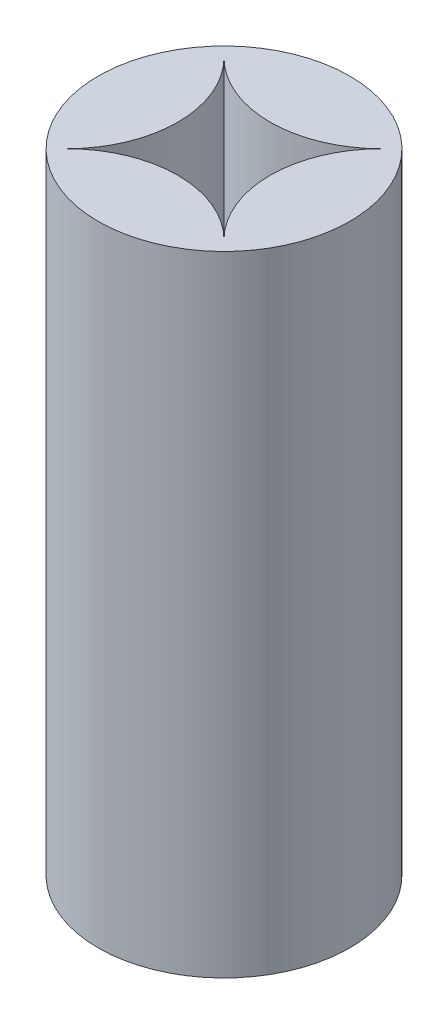
ISO-10303-21;
HEADER;
FILE_DESCRIPTION(('STEP AP214'),'2;1');
FILE_NAME('part.step','',(''),(''),'','','');
FILE_SCHEMA(('AUTOMOTIVE_DESIGN { 1 0 10303 214 1 1 1 1 }'));
ENDSEC;
DATA;
#1=APPLICATION_CONTEXT('core data for automotive mechanical design processes');
#2=APPLICATION_PROTOCOL_DEFINITION('international standard','automotive_design',2000,#1);
#3=PRODUCT_CONTEXT('',#1,'mechanical');
#4=PRODUCT('Part','Part','',(#3));
#5=PRODUCT_RELATED_PRODUCT_CATEGORY('part','',(#4));
#6=PRODUCT_DEFINITION_FORMATION('','',#4);
#7=PRODUCT_DEFINITION_CONTEXT('part definition',#1,'design');
#8=PRODUCT_DEFINITION('design','',#6,#7);
#9=PRODUCT_DEFINITION_SHAPE('','',#8);
#10=(LENGTH_UNIT() NAMED_UNIT(*) SI_UNIT(.MILLI.,.METRE.));
#11=(NAMED_UNIT(*) PLANE_ANGLE_UNIT() SI_UNIT($,.RADIAN.));
#12=(NAMED_UNIT(*) SI_UNIT($,.STERADIAN.) SOLID_ANGLE_UNIT());
#13=UNCERTAINTY_MEASURE_WITH_UNIT(LENGTH_MEASURE(1.E-05),#10,'distance_accuracy_value','');
#14=(GEOMETRIC_REPRESENTATION_CONTEXT(3) GLOBAL_UNCERTAINTY_ASSIGNED_CONTEXT((#13)) GLOBAL_UNIT_ASSIGNED_CONTEXT((#10,
#11,#12)) REPRESENTATION_CONTEXT('',''));
#15=CARTESIAN_POINT('',(0.,0.,0.));
#16=DIRECTION('',(0.,0.,1.));
#17=DIRECTION('',(1.,0.,0.));
#18=AXIS2_PLACEMENT_3D('',#15,#16,#17);
#19=CARTESIAN_POINT('',(0.,20.,0.));
#20=DIRECTION('',(0.,1.,0.));
#21=DIRECTION('',(0.,0.,1.));
#22=AXIS2_PLACEMENT_3D('',#19,#20,#21);
#23=PLANE('',#22);
#24=CARTESIAN_POINT('',(0.,20.,0.));
#25=DIRECTION('',(0.,1.,0.));
#26=DIRECTION('',(0.,0.,1.));
#27=AXIS2_PLACEMENT_3D('',#24,#25,#26);
#28=CIRCLE('',#27,4.);
#29=CARTESIAN_POINT('',(0.,20.,4.));
#30=VERTEX_POINT('',#29);
#31=EDGE_CURVE('E11',#30,#30,#28,.T.);
#32=ORIENTED_EDGE('',*,*,#31,.T.);
#33=EDGE_LOOP('',(#32));
#34=FACE_BOUND('',#33,.T.);
#35=CARTESIAN_POINT('',(0.,20.,-5.));
#36=DIRECTION('',(0.,-1.,0.));
#37=DIRECTION('',(0.,0.,1.));
#38=AXIS2_PLACEMENT_3D('',#35,#36,#37);
#39=CIRCLE('',#38,3.53553390593274);
#40=CARTESIAN_POINT('',(2.5,20.,-2.5));
#41=VERTEX_POINT('',#40);
#42=CARTESIAN_POINT('',(-2.5,20.,-2.5));
#43=VERTEX_POINT('',#42);
#44=EDGE_CURVE('E86',#41,#43,#39,.T.);
#45=ORIENTED_EDGE('',*,*,#44,.F.);
#46=CARTESIAN_POINT('',(5.,20.,0.));
#47=DIRECTION('',(0.,-1.,0.));
#48=DIRECTION('',(0.,0.,-1.));
#49=AXIS2_PLACEMENT_3D('',#46,#47,#48);
#50=CIRCLE('',#49,3.53553390593274);
#51=CARTESIAN_POINT('',(2.5,20.,2.5));
#52=VERTEX_POINT('',#51);
#53=EDGE_CURVE('E78',#52,#41,#50,.T.);
#54=ORIENTED_EDGE('',*,*,#53,.F.);
#55=CARTESIAN_POINT('',(0.,20.,5.));
#56=DIRECTION('',(0.,-1.,0.));
#57=DIRECTION('',(0.,0.,1.));
#58=AXIS2_PLACEMENT_3D('',#55,#56,#57);
#59=CIRCLE('',#58,3.53553390593274);
#60=CARTESIAN_POINT('',(-2.5,20.,2.5));
#61=VERTEX_POINT('',#60);
#62=EDGE_CURVE('E99',#61,#52,#59,.T.);
#63=ORIENTED_EDGE('',*,*,#62,.F.);
#64=CARTESIAN_POINT('',(-5.,20.,0.));
#65=DIRECTION('',(0.,-1.,0.));
#66=DIRECTION('',(0.,0.,-1.));
#67=AXIS2_PLACEMENT_3D('',#64,#65,#66);
#68=CIRCLE('',#67,3.53553390593274);
#69=EDGE_CURVE('E97',#43,#61,#68,.T.);
#70=ORIENTED_EDGE('',*,*,#69,.F.);
#71=EDGE_LOOP('',(#45,#54,#63,#70));
#72=FACE_BOUND('',#71,.T.);
#73=ADVANCED_FACE('F37',(#34,#72),#23,.T.);
#74=CARTESIAN_POINT('',(0.,0.,0.));
#75=DIRECTION('',(0.,1.,0.));
#76=DIRECTION('',(0.,0.,1.));
#77=AXIS2_PLACEMENT_3D('',#74,#75,#76);
#78=PLANE('',#77);
#79=CARTESIAN_POINT('',(0.,0.,0.));
#80=DIRECTION('',(0.,1.,0.));
#81=DIRECTION('',(0.,0.,1.));
#82=AXIS2_PLACEMENT_3D('',#79,#80,#81);
#83=CIRCLE('',#82,4.);
#84=CARTESIAN_POINT('',(0.,0.,4.));
#85=VERTEX_POINT('',#84);
#86=EDGE_CURVE('E41',#85,#85,#83,.T.);
#87=ORIENTED_EDGE('',*,*,#86,.F.);
#88=EDGE_LOOP('',(#87));
#89=FACE_BOUND('',#88,.T.);
#90=CARTESIAN_POINT('',(5.,0.,0.));
#91=DIRECTION('',(0.,-1.,0.));
#92=DIRECTION('',(0.,0.,-1.));
#93=AXIS2_PLACEMENT_3D('',#90,#91,#92);
#94=CIRCLE('',#93,3.53553390593274);
#95=CARTESIAN_POINT('',(2.5,0.,2.5));
#96=VERTEX_POINT('',#95);
#97=CARTESIAN_POINT('',(2.5,0.,-2.5));
#98=VERTEX_POINT('',#97);
#99=EDGE_CURVE('E60',#96,#98,#94,.T.);
#100=ORIENTED_EDGE('',*,*,#99,.T.);
#101=CARTESIAN_POINT('',(0.,0.,-5.));
#102=DIRECTION('',(0.,-1.,0.));
#103=DIRECTION('',(0.,0.,1.));
#104=AXIS2_PLACEMENT_3D('',#101,#102,#103);
#105=CIRCLE('',#104,3.53553390593274);
#106=CARTESIAN_POINT('',(-2.5,0.,-2.5));
#107=VERTEX_POINT('',#106);
#108=EDGE_CURVE('E93',#98,#107,#105,.T.);
#109=ORIENTED_EDGE('',*,*,#108,.T.);
#110=CARTESIAN_POINT('',(-5.,0.,0.));
#111=DIRECTION('',(0.,-1.,0.));
#112=DIRECTION('',(0.,0.,-1.));
#113=AXIS2_PLACEMENT_3D('',#110,#111,#112);
#114=CIRCLE('',#113,3.53553390593274);
#115=CARTESIAN_POINT('',(-2.5,0.,2.5));
#116=VERTEX_POINT('',#115);
#117=EDGE_CURVE('E105',#107,#116,#114,.T.);
#118=ORIENTED_EDGE('',*,*,#117,.T.);
#119=CARTESIAN_POINT('',(0.,0.,5.));
#120=DIRECTION('',(0.,-1.,0.));
#121=DIRECTION('',(0.,0.,1.));
#122=AXIS2_PLACEMENT_3D('',#119,#120,#121);
#123=CIRCLE('',#122,3.53553390593274);
#124=EDGE_CURVE('E87',#116,#96,#123,.T.);
#125=ORIENTED_EDGE('',*,*,#124,.T.);
#126=EDGE_LOOP('',(#100,#109,#118,#125));
#127=FACE_BOUND('',#126,.T.);
#128=ADVANCED_FACE('F116',(#89,#127),#78,.F.);
#129=CARTESIAN_POINT('',(0.,20.,0.));
#130=DIRECTION('',(0.,-1.,0.));
#131=DIRECTION('',(0.,0.,-1.));
#132=AXIS2_PLACEMENT_3D('',#129,#130,#131);
#133=CYLINDRICAL_SURFACE('',#132,4.);
#134=ORIENTED_EDGE('',*,*,#31,.F.);
#135=EDGE_LOOP('',(#134));
#136=FACE_BOUND('',#135,.T.);
#137=ORIENTED_EDGE('',*,*,#86,.T.);
#138=EDGE_LOOP('',(#137));
#139=FACE_BOUND('',#138,.T.);
#140=ADVANCED_FACE('F39',(#136,#139),#133,.T.);
#141=CARTESIAN_POINT('',(5.,20.,0.));
#142=DIRECTION('',(0.,-1.,0.));
#143=DIRECTION('',(0.,0.,-1.));
#144=AXIS2_PLACEMENT_3D('',#141,#142,#143);
#145=CYLINDRICAL_SURFACE('',#144,3.53553390593274);
#146=ORIENTED_EDGE('',*,*,#99,.F.);
#147=DIRECTION('',(0.,-1.,0.));
#148=VECTOR('',#147,1.);
#149=CARTESIAN_POINT('',(2.5,20.,2.5));
#150=LINE('',#149,#148);
#151=EDGE_CURVE('E82',#52,#96,#150,.T.);
#152=ORIENTED_EDGE('',*,*,#151,.F.);
#153=ORIENTED_EDGE('',*,*,#53,.T.);
#154=DIRECTION('',(0.,-1.,0.));
#155=VECTOR('',#154,1.);
#156=CARTESIAN_POINT('',(2.5,20.,-2.5));
#157=LINE('',#156,#155);
#158=EDGE_CURVE('E81',#41,#98,#157,.T.);
#159=ORIENTED_EDGE('',*,*,#158,.T.);
#160=EDGE_LOOP('',(#146,#152,#153,#159));
#161=FACE_BOUND('',#160,.T.);
#162=ADVANCED_FACE('F80',(#161),#145,.T.);
#163=CARTESIAN_POINT('',(0.,20.,-5.));
#164=DIRECTION('',(0.,-1.,0.));
#165=DIRECTION('',(0.,0.,-1.));
#166=AXIS2_PLACEMENT_3D('',#163,#164,#165);
#167=CYLINDRICAL_SURFACE('',#166,3.53553390593274);
#168=ORIENTED_EDGE('',*,*,#108,.F.);
#169=ORIENTED_EDGE('',*,*,#158,.F.);
#170=ORIENTED_EDGE('',*,*,#44,.T.);
#171=DIRECTION('',(0.,-1.,0.));
#172=VECTOR('',#171,1.);
#173=CARTESIAN_POINT('',(-2.5,20.,-2.5));
#174=LINE('',#173,#172);
#175=EDGE_CURVE('E94',#43,#107,#174,.T.);
#176=ORIENTED_EDGE('',*,*,#175,.T.);
#177=EDGE_LOOP('',(#168,#169,#170,#176));
#178=FACE_BOUND('',#177,.T.);
#179=ADVANCED_FACE('F90',(#178),#167,.T.);
#180=CARTESIAN_POINT('',(-5.,20.,0.));
#181=DIRECTION('',(0.,-1.,0.));
#182=DIRECTION('',(0.,0.,-1.));
#183=AXIS2_PLACEMENT_3D('',#180,#181,#182);
#184=CYLINDRICAL_SURFACE('',#183,3.53553390593274);
#185=ORIENTED_EDGE('',*,*,#117,.F.);
#186=ORIENTED_EDGE('',*,*,#175,.F.);
#187=ORIENTED_EDGE('',*,*,#69,.T.);
#188=DIRECTION('',(0.,-1.,0.));
#189=VECTOR('',#188,1.);
#190=CARTESIAN_POINT('',(-2.5,20.,2.5));
#191=LINE('',#190,#189);
#192=EDGE_CURVE('E52',#61,#116,#191,.T.);
#193=ORIENTED_EDGE('',*,*,#192,.T.);
#194=EDGE_LOOP('',(#185,#186,#187,#193));
#195=FACE_BOUND('',#194,.T.);
#196=ADVANCED_FACE('F114',(#195),#184,.T.);
#197=CARTESIAN_POINT('',(0.,20.,5.));
#198=DIRECTION('',(0.,-1.,0.));
#199=DIRECTION('',(0.,0.,-1.));
#200=AXIS2_PLACEMENT_3D('',#197,#198,#199);
#201=CYLINDRICAL_SURFACE('',#200,3.53553390593274);
#202=ORIENTED_EDGE('',*,*,#124,.F.);
#203=ORIENTED_EDGE('',*,*,#192,.F.);
#204=ORIENTED_EDGE('',*,*,#62,.T.);
#205=ORIENTED_EDGE('',*,*,#151,.T.);
#206=EDGE_LOOP('',(#202,#203,#204,#205));
#207=FACE_BOUND('',#206,.T.);
#208=ADVANCED_FACE('F117',(#207),#201,.T.);
#209=CLOSED_SHELL('',(#73,#128,#140,#162,#179,#196,#208));
#210=MANIFOLD_SOLID_BREP('B2',#209);
#211=ADVANCED_BREP_SHAPE_REPRESENTATION('',(#18,#210),#14);
#212=SHAPE_DEFINITION_REPRESENTATION(#9,#211);
ENDSEC;
END-ISO-10303-21;
